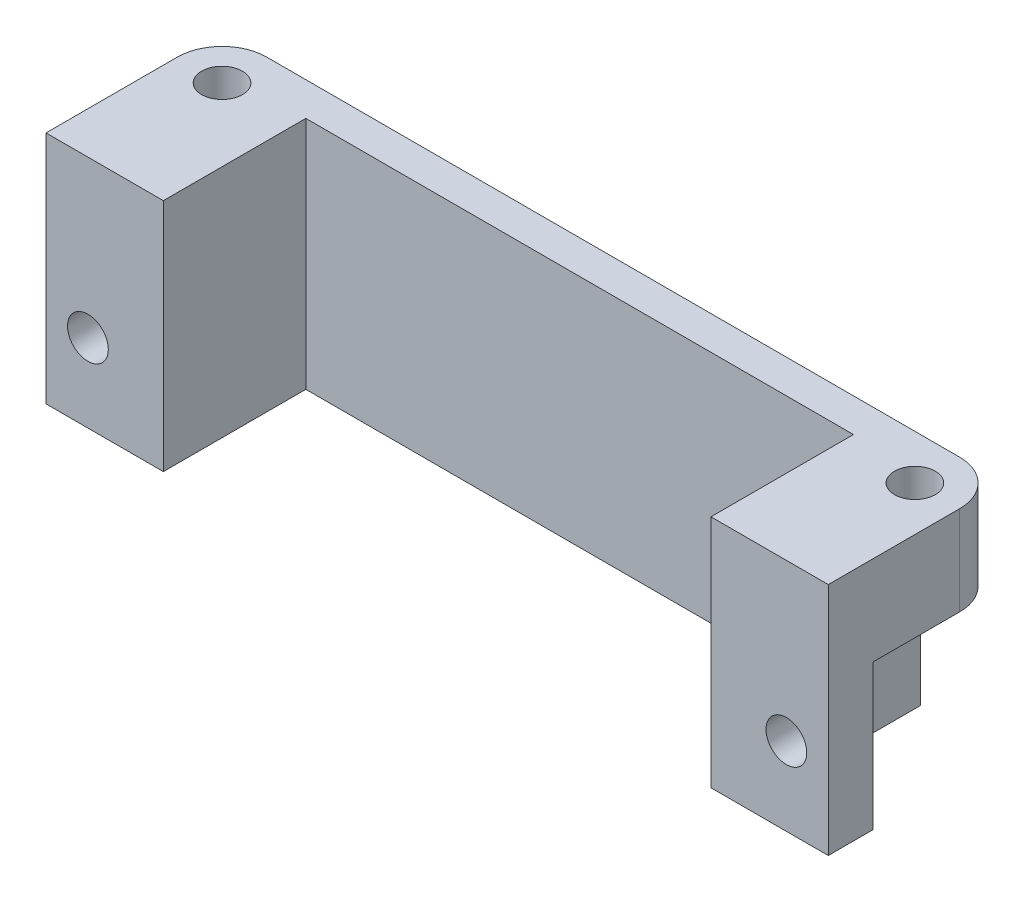
ISO-10303-21;
HEADER;
FILE_DESCRIPTION(('STEP AP214'),'2;1');
FILE_NAME('part.step','',(''),(''),'','','');
FILE_SCHEMA(('AUTOMOTIVE_DESIGN { 1 0 10303 214 1 1 1 1 }'));
ENDSEC;
DATA;
#1=APPLICATION_CONTEXT('core data for automotive mechanical design processes');
#2=APPLICATION_PROTOCOL_DEFINITION('international standard','automotive_design',2000,#1);
#3=PRODUCT_CONTEXT('',#1,'mechanical');
#4=PRODUCT('Part','Part','',(#3));
#5=PRODUCT_RELATED_PRODUCT_CATEGORY('part','',(#4));
#6=PRODUCT_DEFINITION_FORMATION('','',#4);
#7=PRODUCT_DEFINITION_CONTEXT('part definition',#1,'design');
#8=PRODUCT_DEFINITION('design','',#6,#7);
#9=PRODUCT_DEFINITION_SHAPE('','',#8);
#10=(LENGTH_UNIT() NAMED_UNIT(*) SI_UNIT(.MILLI.,.METRE.));
#11=(NAMED_UNIT(*) PLANE_ANGLE_UNIT() SI_UNIT($,.RADIAN.));
#12=(NAMED_UNIT(*) SI_UNIT($,.STERADIAN.) SOLID_ANGLE_UNIT());
#13=UNCERTAINTY_MEASURE_WITH_UNIT(LENGTH_MEASURE(1.E-05),#10,'distance_accuracy_value','');
#14=(GEOMETRIC_REPRESENTATION_CONTEXT(3) GLOBAL_UNCERTAINTY_ASSIGNED_CONTEXT((#13)) GLOBAL_UNIT_ASSIGNED_CONTEXT((#10,
#11,#12)) REPRESENTATION_CONTEXT('',''));
#15=CARTESIAN_POINT('',(0.,0.,0.));
#16=DIRECTION('',(0.,0.,1.));
#17=DIRECTION('',(1.,0.,0.));
#18=AXIS2_PLACEMENT_3D('',#15,#16,#17);
#19=CARTESIAN_POINT('',(0.,21.,-15.75));
#20=DIRECTION('',(0.,0.,1.));
#21=DIRECTION('',(1.,0.,0.));
#22=AXIS2_PLACEMENT_3D('',#19,#20,#21);
#23=PLANE('',#22);
#24=DIRECTION('',(-1.,0.,0.));
#25=VECTOR('',#24,1.);
#26=CARTESIAN_POINT('',(0.,21.,-15.75));
#27=LINE('',#26,#25);
#28=CARTESIAN_POINT('',(31.,21.,-15.75));
#29=VERTEX_POINT('',#28);
#30=CARTESIAN_POINT('',(-31.,21.,-15.75));
#31=VERTEX_POINT('',#30);
#32=EDGE_CURVE('E250',#29,#31,#27,.T.);
#33=ORIENTED_EDGE('',*,*,#32,.F.);
#34=DIRECTION('',(0.,-1.,0.));
#35=VECTOR('',#34,1.);
#36=CARTESIAN_POINT('',(31.,21.,-15.75));
#37=LINE('',#36,#35);
#38=CARTESIAN_POINT('',(31.,13.,-15.7500000000001));
#39=VERTEX_POINT('',#38);
#40=EDGE_CURVE('E280',#29,#39,#37,.T.);
#41=ORIENTED_EDGE('',*,*,#40,.T.);
#42=DIRECTION('',(-1.,0.,0.));
#43=VECTOR('',#42,1.);
#44=CARTESIAN_POINT('',(35.,13.,-15.7500000000001));
#45=LINE('',#44,#43);
#46=CARTESIAN_POINT('',(27.5,13.,-15.7500000000001));
#47=VERTEX_POINT('',#46);
#48=EDGE_CURVE('E168',#39,#47,#45,.T.);
#49=ORIENTED_EDGE('',*,*,#48,.T.);
#50=DIRECTION('',(0.,-1.,0.));
#51=VECTOR('',#50,1.);
#52=CARTESIAN_POINT('',(27.5,13.,-15.7500000000001));
#53=LINE('',#52,#51);
#54=CARTESIAN_POINT('',(27.5,0.,-15.7500000000001));
#55=VERTEX_POINT('',#54);
#56=EDGE_CURVE('E170',#47,#55,#53,.T.);
#57=ORIENTED_EDGE('',*,*,#56,.T.);
#58=DIRECTION('',(-1.,0.,0.));
#59=VECTOR('',#58,1.);
#60=CARTESIAN_POINT('',(0.,0.,-15.75));
#61=LINE('',#60,#59);
#62=CARTESIAN_POINT('',(-27.5,0.,-15.75));
#63=VERTEX_POINT('',#62);
#64=EDGE_CURVE('E242',#55,#63,#61,.T.);
#65=ORIENTED_EDGE('',*,*,#64,.T.);
#66=DIRECTION('',(0.,-1.,0.));
#67=VECTOR('',#66,1.);
#68=CARTESIAN_POINT('',(-27.5,13.,-15.75));
#69=LINE('',#68,#67);
#70=CARTESIAN_POINT('',(-27.5,13.,-15.75));
#71=VERTEX_POINT('',#70);
#72=EDGE_CURVE('E220',#71,#63,#69,.T.);
#73=ORIENTED_EDGE('',*,*,#72,.F.);
#74=DIRECTION('',(1.,0.,0.));
#75=VECTOR('',#74,1.);
#76=CARTESIAN_POINT('',(-35.,13.,-15.75));
#77=LINE('',#76,#75);
#78=CARTESIAN_POINT('',(-31.,13.,-15.75));
#79=VERTEX_POINT('',#78);
#80=EDGE_CURVE('E211',#79,#71,#77,.T.);
#81=ORIENTED_EDGE('',*,*,#80,.F.);
#82=DIRECTION('',(0.,-1.,0.));
#83=VECTOR('',#82,1.);
#84=CARTESIAN_POINT('',(-31.,21.,-15.75));
#85=LINE('',#84,#83);
#86=EDGE_CURVE('E275',#79,#31,#85,.F.);
#87=ORIENTED_EDGE('',*,*,#86,.T.);
#88=EDGE_LOOP('',(#33,#41,#49,#57,#65,#73,#81,#87));
#89=FACE_BOUND('',#88,.T.);
#90=ADVANCED_FACE('F36',(#89),#23,.F.);
#91=CARTESIAN_POINT('',(0.,0.,0.));
#92=DIRECTION('',(0.,1.,0.));
#93=DIRECTION('',(0.,0.,1.));
#94=AXIS2_PLACEMENT_3D('',#91,#92,#93);
#95=PLANE('',#94);
#96=DIRECTION('',(0.,0.,1.));
#97=VECTOR('',#96,1.);
#98=CARTESIAN_POINT('',(27.5,0.,-15.7500000000001));
#99=LINE('',#98,#97);
#100=CARTESIAN_POINT('',(27.5,0.,-4.00000000000006));
#101=VERTEX_POINT('',#100);
#102=EDGE_CURVE('E161',#55,#101,#99,.T.);
#103=ORIENTED_EDGE('',*,*,#102,.T.);
#104=DIRECTION('',(1.,0.,0.));
#105=VECTOR('',#104,1.);
#106=CARTESIAN_POINT('',(35.,0.,-4.00000000000008));
#107=LINE('',#106,#105);
#108=CARTESIAN_POINT('',(35.,0.,-4.00000000000008));
#109=VERTEX_POINT('',#108);
#110=EDGE_CURVE('E293',#101,#109,#107,.T.);
#111=ORIENTED_EDGE('',*,*,#110,.T.);
#112=DIRECTION('',(0.,0.,-1.));
#113=VECTOR('',#112,1.);
#114=CARTESIAN_POINT('',(35.,0.,0.));
#115=LINE('',#114,#113);
#116=CARTESIAN_POINT('',(35.,0.,0.));
#117=VERTEX_POINT('',#116);
#118=EDGE_CURVE('E167',#117,#109,#115,.T.);
#119=ORIENTED_EDGE('',*,*,#118,.F.);
#120=DIRECTION('',(1.,0.,0.));
#121=VECTOR('',#120,1.);
#122=CARTESIAN_POINT('',(0.,0.,0.));
#123=LINE('',#122,#121);
#124=CARTESIAN_POINT('',(24.5,0.,0.));
#125=VERTEX_POINT('',#124);
#126=EDGE_CURVE('E184',#125,#117,#123,.T.);
#127=ORIENTED_EDGE('',*,*,#126,.F.);
#128=DIRECTION('',(0.,0.,-1.));
#129=VECTOR('',#128,1.);
#130=CARTESIAN_POINT('',(24.5,0.,0.));
#131=LINE('',#130,#129);
#132=CARTESIAN_POINT('',(24.5,0.,-12.7500000000001));
#133=VERTEX_POINT('',#132);
#134=EDGE_CURVE('E191',#125,#133,#131,.T.);
#135=ORIENTED_EDGE('',*,*,#134,.T.);
#136=DIRECTION('',(-1.,0.,0.));
#137=VECTOR('',#136,1.);
#138=CARTESIAN_POINT('',(0.,0.,-12.75));
#139=LINE('',#138,#137);
#140=CARTESIAN_POINT('',(-24.5,0.,-12.75));
#141=VERTEX_POINT('',#140);
#142=EDGE_CURVE('E261',#133,#141,#139,.T.);
#143=ORIENTED_EDGE('',*,*,#142,.T.);
#144=DIRECTION('',(0.,0.,-1.));
#145=VECTOR('',#144,1.);
#146=CARTESIAN_POINT('',(-24.5,0.,0.));
#147=LINE('',#146,#145);
#148=CARTESIAN_POINT('',(-24.5,0.,0.));
#149=VERTEX_POINT('',#148);
#150=EDGE_CURVE('E258',#149,#141,#147,.T.);
#151=ORIENTED_EDGE('',*,*,#150,.F.);
#152=DIRECTION('',(-1.,0.,0.));
#153=VECTOR('',#152,1.);
#154=CARTESIAN_POINT('',(0.,0.,0.));
#155=LINE('',#154,#153);
#156=CARTESIAN_POINT('',(-35.,0.,0.));
#157=VERTEX_POINT('',#156);
#158=EDGE_CURVE('E255',#149,#157,#155,.T.);
#159=ORIENTED_EDGE('',*,*,#158,.T.);
#160=DIRECTION('',(0.,0.,-1.));
#161=VECTOR('',#160,1.);
#162=CARTESIAN_POINT('',(-35.,0.,0.));
#163=LINE('',#162,#161);
#164=CARTESIAN_POINT('',(-35.,0.,-4.));
#165=VERTEX_POINT('',#164);
#166=EDGE_CURVE('E237',#157,#165,#163,.T.);
#167=ORIENTED_EDGE('',*,*,#166,.T.);
#168=DIRECTION('',(-1.,0.,0.));
#169=VECTOR('',#168,1.);
#170=CARTESIAN_POINT('',(-35.,0.,-4.));
#171=LINE('',#170,#169);
#172=CARTESIAN_POINT('',(-27.5,0.,-4.));
#173=VERTEX_POINT('',#172);
#174=EDGE_CURVE('E212',#173,#165,#171,.T.);
#175=ORIENTED_EDGE('',*,*,#174,.F.);
#176=DIRECTION('',(0.,0.,1.));
#177=VECTOR('',#176,1.);
#178=CARTESIAN_POINT('',(-27.5,0.,-15.75));
#179=LINE('',#178,#177);
#180=EDGE_CURVE('E205',#63,#173,#179,.T.);
#181=ORIENTED_EDGE('',*,*,#180,.F.);
#182=ORIENTED_EDGE('',*,*,#64,.F.);
#183=EDGE_LOOP('',(#103,#111,#119,#127,#135,#143,#151,#159,#167,#175,#181,#182));
#184=FACE_BOUND('',#183,.T.);
#185=ADVANCED_FACE('F301',(#184),#95,.F.);
#186=CARTESIAN_POINT('',(35.,21.,0.));
#187=DIRECTION('',(-1.,0.,0.));
#188=DIRECTION('',(0.,0.,1.));
#189=AXIS2_PLACEMENT_3D('',#186,#187,#188);
#190=PLANE('',#189);
#191=DIRECTION('',(0.,0.,-1.));
#192=VECTOR('',#191,1.);
#193=CARTESIAN_POINT('',(35.,13.,-15.7500000000001));
#194=LINE('',#193,#192);
#195=CARTESIAN_POINT('',(35.,13.,-4.00000000000008));
#196=VERTEX_POINT('',#195);
#197=CARTESIAN_POINT('',(35.,13.,-11.75));
#198=VERTEX_POINT('',#197);
#199=EDGE_CURVE('E158',#196,#198,#194,.T.);
#200=ORIENTED_EDGE('',*,*,#199,.T.);
#201=DIRECTION('',(0.,-1.,0.));
#202=VECTOR('',#201,1.);
#203=CARTESIAN_POINT('',(35.,21.,-11.75));
#204=LINE('',#203,#202);
#205=CARTESIAN_POINT('',(35.,21.,-11.75));
#206=VERTEX_POINT('',#205);
#207=EDGE_CURVE('E44',#198,#206,#204,.F.);
#208=ORIENTED_EDGE('',*,*,#207,.T.);
#209=DIRECTION('',(0.,0.,-1.));
#210=VECTOR('',#209,1.);
#211=CARTESIAN_POINT('',(35.,21.,0.));
#212=LINE('',#211,#210);
#213=CARTESIAN_POINT('',(35.,21.,0.));
#214=VERTEX_POINT('',#213);
#215=EDGE_CURVE('E181',#214,#206,#212,.T.);
#216=ORIENTED_EDGE('',*,*,#215,.F.);
#217=DIRECTION('',(0.,-1.,0.));
#218=VECTOR('',#217,1.);
#219=CARTESIAN_POINT('',(35.,21.,0.));
#220=LINE('',#219,#218);
#221=EDGE_CURVE('E189',#214,#117,#220,.T.);
#222=ORIENTED_EDGE('',*,*,#221,.T.);
#223=ORIENTED_EDGE('',*,*,#118,.T.);
#224=DIRECTION('',(0.,-1.,0.));
#225=VECTOR('',#224,1.);
#226=CARTESIAN_POINT('',(35.,13.,-4.00000000000008));
#227=LINE('',#226,#225);
#228=EDGE_CURVE('E153',#196,#109,#227,.T.);
#229=ORIENTED_EDGE('',*,*,#228,.F.);
#230=EDGE_LOOP('',(#200,#208,#216,#222,#223,#229));
#231=FACE_BOUND('',#230,.T.);
#232=ADVANCED_FACE('F164',(#231),#190,.F.);
#233=CARTESIAN_POINT('',(-35.,21.,0.));
#234=DIRECTION('',(-1.,0.,0.));
#235=DIRECTION('',(0.,0.,1.));
#236=AXIS2_PLACEMENT_3D('',#233,#234,#235);
#237=PLANE('',#236);
#238=DIRECTION('',(0.,0.,-1.));
#239=VECTOR('',#238,1.);
#240=CARTESIAN_POINT('',(-35.,21.,0.));
#241=LINE('',#240,#239);
#242=CARTESIAN_POINT('',(-35.,21.,0.));
#243=VERTEX_POINT('',#242);
#244=CARTESIAN_POINT('',(-35.,21.,-11.75));
#245=VERTEX_POINT('',#244);
#246=EDGE_CURVE('E238',#243,#245,#241,.T.);
#247=ORIENTED_EDGE('',*,*,#246,.T.);
#248=DIRECTION('',(0.,-1.,0.));
#249=VECTOR('',#248,1.);
#250=CARTESIAN_POINT('',(-35.,13.,-11.75));
#251=LINE('',#250,#249);
#252=CARTESIAN_POINT('',(-35.,13.,-11.75));
#253=VERTEX_POINT('',#252);
#254=EDGE_CURVE('E270',#245,#253,#251,.T.);
#255=ORIENTED_EDGE('',*,*,#254,.T.);
#256=DIRECTION('',(0.,0.,-1.));
#257=VECTOR('',#256,1.);
#258=CARTESIAN_POINT('',(-35.,13.,-15.75));
#259=LINE('',#258,#257);
#260=CARTESIAN_POINT('',(-35.,13.,-4.));
#261=VERTEX_POINT('',#260);
#262=EDGE_CURVE('E208',#261,#253,#259,.T.);
#263=ORIENTED_EDGE('',*,*,#262,.F.);
#264=DIRECTION('',(0.,-1.,0.));
#265=VECTOR('',#264,1.);
#266=CARTESIAN_POINT('',(-35.,13.,-4.));
#267=LINE('',#266,#265);
#268=EDGE_CURVE('E224',#261,#165,#267,.T.);
#269=ORIENTED_EDGE('',*,*,#268,.T.);
#270=ORIENTED_EDGE('',*,*,#166,.F.);
#271=DIRECTION('',(0.,-1.,0.));
#272=VECTOR('',#271,1.);
#273=CARTESIAN_POINT('',(-35.,21.,0.));
#274=LINE('',#273,#272);
#275=EDGE_CURVE('E268',#243,#157,#274,.T.);
#276=ORIENTED_EDGE('',*,*,#275,.F.);
#277=EDGE_LOOP('',(#247,#255,#263,#269,#270,#276));
#278=FACE_BOUND('',#277,.T.);
#279=ADVANCED_FACE('F318',(#278),#237,.T.);
#280=CARTESIAN_POINT('',(0.,21.,0.));
#281=DIRECTION('',(0.,0.,1.));
#282=DIRECTION('',(1.,0.,0.));
#283=AXIS2_PLACEMENT_3D('',#280,#281,#282);
#284=PLANE('',#283);
#285=CARTESIAN_POINT('',(-31.25,7.,0.));
#286=DIRECTION('',(0.,0.,1.));
#287=DIRECTION('',(1.,0.,0.));
#288=AXIS2_PLACEMENT_3D('',#285,#286,#287);
#289=CIRCLE('',#288,1.825);
#290=CARTESIAN_POINT('',(-29.425,7.,0.));
#291=VERTEX_POINT('',#290);
#292=EDGE_CURVE('E234',#291,#291,#289,.T.);
#293=ORIENTED_EDGE('',*,*,#292,.F.);
#294=EDGE_LOOP('',(#293));
#295=FACE_BOUND('',#294,.T.);
#296=ORIENTED_EDGE('',*,*,#158,.F.);
#297=DIRECTION('',(0.,-1.,0.));
#298=VECTOR('',#297,1.);
#299=CARTESIAN_POINT('',(-24.5,21.,0.));
#300=LINE('',#299,#298);
#301=CARTESIAN_POINT('',(-24.5,21.,0.));
#302=VERTEX_POINT('',#301);
#303=EDGE_CURVE('E266',#302,#149,#300,.T.);
#304=ORIENTED_EDGE('',*,*,#303,.F.);
#305=DIRECTION('',(-1.,0.,0.));
#306=VECTOR('',#305,1.);
#307=CARTESIAN_POINT('',(0.,21.,0.));
#308=LINE('',#307,#306);
#309=EDGE_CURVE('E241',#302,#243,#308,.T.);
#310=ORIENTED_EDGE('',*,*,#309,.T.);
#311=ORIENTED_EDGE('',*,*,#275,.T.);
#312=EDGE_LOOP('',(#296,#304,#310,#311));
#313=FACE_BOUND('',#312,.T.);
#314=ADVANCED_FACE('F323',(#295,#313),#284,.T.);
#315=CARTESIAN_POINT('',(-24.5,21.,0.));
#316=DIRECTION('',(-1.,0.,0.));
#317=DIRECTION('',(0.,0.,1.));
#318=AXIS2_PLACEMENT_3D('',#315,#316,#317);
#319=PLANE('',#318);
#320=ORIENTED_EDGE('',*,*,#150,.T.);
#321=DIRECTION('',(0.,-1.,0.));
#322=VECTOR('',#321,1.);
#323=CARTESIAN_POINT('',(-24.5,21.,-12.75));
#324=LINE('',#323,#322);
#325=CARTESIAN_POINT('',(-24.5,21.,-12.75));
#326=VERTEX_POINT('',#325);
#327=EDGE_CURVE('E252',#326,#141,#324,.T.);
#328=ORIENTED_EDGE('',*,*,#327,.F.);
#329=DIRECTION('',(0.,0.,-1.));
#330=VECTOR('',#329,1.);
#331=CARTESIAN_POINT('',(-24.5,21.,0.));
#332=LINE('',#331,#330);
#333=EDGE_CURVE('E245',#302,#326,#332,.T.);
#334=ORIENTED_EDGE('',*,*,#333,.F.);
#335=ORIENTED_EDGE('',*,*,#303,.T.);
#336=EDGE_LOOP('',(#320,#328,#334,#335));
#337=FACE_BOUND('',#336,.T.);
#338=ADVANCED_FACE('F329',(#337),#319,.F.);
#339=CARTESIAN_POINT('',(0.,21.,-12.75));
#340=DIRECTION('',(0.,0.,1.));
#341=DIRECTION('',(1.,0.,0.));
#342=AXIS2_PLACEMENT_3D('',#339,#340,#341);
#343=PLANE('',#342);
#344=ORIENTED_EDGE('',*,*,#142,.F.);
#345=DIRECTION('',(0.,-1.,0.));
#346=VECTOR('',#345,1.);
#347=CARTESIAN_POINT('',(24.5,21.,-12.7500000000001));
#348=LINE('',#347,#346);
#349=CARTESIAN_POINT('',(24.5,21.,-12.7500000000001));
#350=VERTEX_POINT('',#349);
#351=EDGE_CURVE('E198',#350,#133,#348,.T.);
#352=ORIENTED_EDGE('',*,*,#351,.F.);
#353=DIRECTION('',(-1.,0.,0.));
#354=VECTOR('',#353,1.);
#355=CARTESIAN_POINT('',(0.,21.,-12.75));
#356=LINE('',#355,#354);
#357=EDGE_CURVE('E247',#350,#326,#356,.T.);
#358=ORIENTED_EDGE('',*,*,#357,.T.);
#359=ORIENTED_EDGE('',*,*,#327,.T.);
#360=EDGE_LOOP('',(#344,#352,#358,#359));
#361=FACE_BOUND('',#360,.T.);
#362=ADVANCED_FACE('F332',(#361),#343,.T.);
#363=CARTESIAN_POINT('',(0.,21.,0.));
#364=DIRECTION('',(0.,1.,0.));
#365=DIRECTION('',(0.,0.,1.));
#366=AXIS2_PLACEMENT_3D('',#363,#364,#365);
#367=PLANE('',#366);
#368=CARTESIAN_POINT('',(31.,21.,-11.7500000000001));
#369=DIRECTION('',(0.,1.,0.));
#370=DIRECTION('',(0.,0.,-1.));
#371=AXIS2_PLACEMENT_3D('',#368,#369,#370);
#372=CIRCLE('',#371,1.825);
#373=CARTESIAN_POINT('',(31.,21.,-13.5750000000001));
#374=VERTEX_POINT('',#373);
#375=EDGE_CURVE('E295',#374,#374,#372,.T.);
#376=ORIENTED_EDGE('',*,*,#375,.F.);
#377=EDGE_LOOP('',(#376));
#378=FACE_BOUND('',#377,.T.);
#379=CARTESIAN_POINT('',(-31.,21.,-11.75));
#380=DIRECTION('',(0.,-1.,0.));
#381=DIRECTION('',(0.,0.,-1.));
#382=AXIS2_PLACEMENT_3D('',#379,#380,#381);
#383=CIRCLE('',#382,1.825);
#384=CARTESIAN_POINT('',(-31.,21.,-13.575));
#385=VERTEX_POINT('',#384);
#386=EDGE_CURVE('E202',#385,#385,#383,.T.);
#387=ORIENTED_EDGE('',*,*,#386,.T.);
#388=EDGE_LOOP('',(#387));
#389=FACE_BOUND('',#388,.T.);
#390=ORIENTED_EDGE('',*,*,#215,.T.);
#391=CARTESIAN_POINT('',(31.,21.,-11.75));
#392=DIRECTION('',(0.,1.,0.));
#393=DIRECTION('',(0.,0.,1.));
#394=AXIS2_PLACEMENT_3D('',#391,#392,#393);
#395=CIRCLE('',#394,4.);
#396=EDGE_CURVE('E11',#206,#29,#395,.T.);
#397=ORIENTED_EDGE('',*,*,#396,.T.);
#398=ORIENTED_EDGE('',*,*,#32,.T.);
#399=CARTESIAN_POINT('',(-31.,21.,-11.75));
#400=DIRECTION('',(0.,1.,0.));
#401=DIRECTION('',(0.,0.,1.));
#402=AXIS2_PLACEMENT_3D('',#399,#400,#401);
#403=CIRCLE('',#402,4.);
#404=EDGE_CURVE('E278',#31,#245,#403,.T.);
#405=ORIENTED_EDGE('',*,*,#404,.T.);
#406=ORIENTED_EDGE('',*,*,#246,.F.);
#407=ORIENTED_EDGE('',*,*,#309,.F.);
#408=ORIENTED_EDGE('',*,*,#333,.T.);
#409=ORIENTED_EDGE('',*,*,#357,.F.);
#410=DIRECTION('',(0.,0.,-1.));
#411=VECTOR('',#410,1.);
#412=CARTESIAN_POINT('',(24.5,21.,0.));
#413=LINE('',#412,#411);
#414=CARTESIAN_POINT('',(24.5,21.,0.));
#415=VERTEX_POINT('',#414);
#416=EDGE_CURVE('E183',#415,#350,#413,.T.);
#417=ORIENTED_EDGE('',*,*,#416,.F.);
#418=DIRECTION('',(1.,0.,0.));
#419=VECTOR('',#418,1.);
#420=CARTESIAN_POINT('',(0.,21.,0.));
#421=LINE('',#420,#419);
#422=EDGE_CURVE('E187',#415,#214,#421,.T.);
#423=ORIENTED_EDGE('',*,*,#422,.T.);
#424=EDGE_LOOP('',(#390,#397,#398,#405,#406,#407,#408,#409,#417,#423));
#425=FACE_BOUND('',#424,.T.);
#426=ADVANCED_FACE('F315',(#378,#389,#425),#367,.T.);
#427=CARTESIAN_POINT('',(-31.25,7.,-4.));
#428=DIRECTION('',(0.,0.,1.));
#429=DIRECTION('',(1.,0.,0.));
#430=AXIS2_PLACEMENT_3D('',#427,#428,#429);
#431=CYLINDRICAL_SURFACE('',#430,1.825);
#432=CARTESIAN_POINT('',(-31.25,7.,-4.));
#433=DIRECTION('',(0.,0.,1.));
#434=DIRECTION('',(1.,0.,0.));
#435=AXIS2_PLACEMENT_3D('',#432,#433,#434);
#436=CIRCLE('',#435,1.825);
#437=CARTESIAN_POINT('',(-29.425,7.,-4.));
#438=VERTEX_POINT('',#437);
#439=EDGE_CURVE('E227',#438,#438,#436,.T.);
#440=ORIENTED_EDGE('',*,*,#439,.F.);
#441=EDGE_LOOP('',(#440));
#442=FACE_BOUND('',#441,.T.);
#443=ORIENTED_EDGE('',*,*,#292,.T.);
#444=EDGE_LOOP('',(#443));
#445=FACE_BOUND('',#444,.T.);
#446=ADVANCED_FACE('F389',(#442,#445),#431,.F.);
#447=CARTESIAN_POINT('',(-35.,13.,-4.));
#448=DIRECTION('',(0.,0.,1.));
#449=DIRECTION('',(1.,0.,0.));
#450=AXIS2_PLACEMENT_3D('',#447,#448,#449);
#451=PLANE('',#450);
#452=ORIENTED_EDGE('',*,*,#439,.T.);
#453=EDGE_LOOP('',(#452));
#454=FACE_BOUND('',#453,.T.);
#455=ORIENTED_EDGE('',*,*,#174,.T.);
#456=ORIENTED_EDGE('',*,*,#268,.F.);
#457=DIRECTION('',(-1.,0.,0.));
#458=VECTOR('',#457,1.);
#459=CARTESIAN_POINT('',(-35.,13.,-4.));
#460=LINE('',#459,#458);
#461=CARTESIAN_POINT('',(-27.5,13.,-4.));
#462=VERTEX_POINT('',#461);
#463=EDGE_CURVE('E217',#462,#261,#460,.T.);
#464=ORIENTED_EDGE('',*,*,#463,.F.);
#465=DIRECTION('',(0.,-1.,0.));
#466=VECTOR('',#465,1.);
#467=CARTESIAN_POINT('',(-27.5,13.,-4.));
#468=LINE('',#467,#466);
#469=EDGE_CURVE('E228',#462,#173,#468,.T.);
#470=ORIENTED_EDGE('',*,*,#469,.T.);
#471=EDGE_LOOP('',(#455,#456,#464,#470));
#472=FACE_BOUND('',#471,.T.);
#473=ADVANCED_FACE('F383',(#454,#472),#451,.F.);
#474=CARTESIAN_POINT('',(-27.5,13.,-15.75));
#475=DIRECTION('',(1.,0.,0.));
#476=DIRECTION('',(0.,0.,-1.));
#477=AXIS2_PLACEMENT_3D('',#474,#475,#476);
#478=PLANE('',#477);
#479=ORIENTED_EDGE('',*,*,#180,.T.);
#480=ORIENTED_EDGE('',*,*,#469,.F.);
#481=DIRECTION('',(0.,0.,1.));
#482=VECTOR('',#481,1.);
#483=CARTESIAN_POINT('',(-27.5,13.,-15.75));
#484=LINE('',#483,#482);
#485=EDGE_CURVE('E214',#71,#462,#484,.T.);
#486=ORIENTED_EDGE('',*,*,#485,.F.);
#487=ORIENTED_EDGE('',*,*,#72,.T.);
#488=EDGE_LOOP('',(#479,#480,#486,#487));
#489=FACE_BOUND('',#488,.T.);
#490=ADVANCED_FACE('F304',(#489),#478,.F.);
#491=CARTESIAN_POINT('',(0.,13.,0.));
#492=DIRECTION('',(0.,1.,0.));
#493=DIRECTION('',(0.,0.,1.));
#494=AXIS2_PLACEMENT_3D('',#491,#492,#493);
#495=PLANE('',#494);
#496=CARTESIAN_POINT('',(-31.,13.,-11.75));
#497=DIRECTION('',(0.,-1.,0.));
#498=DIRECTION('',(0.,0.,-1.));
#499=AXIS2_PLACEMENT_3D('',#496,#497,#498);
#500=CIRCLE('',#499,1.825);
#501=CARTESIAN_POINT('',(-31.,13.,-13.575));
#502=VERTEX_POINT('',#501);
#503=EDGE_CURVE('E201',#502,#502,#500,.T.);
#504=ORIENTED_EDGE('',*,*,#503,.F.);
#505=EDGE_LOOP('',(#504));
#506=FACE_BOUND('',#505,.T.);
#507=ORIENTED_EDGE('',*,*,#262,.T.);
#508=CARTESIAN_POINT('',(-31.,13.,-11.75));
#509=DIRECTION('',(0.,1.,0.));
#510=DIRECTION('',(0.,0.,1.));
#511=AXIS2_PLACEMENT_3D('',#508,#509,#510);
#512=CIRCLE('',#511,4.);
#513=EDGE_CURVE('E273',#253,#79,#512,.F.);
#514=ORIENTED_EDGE('',*,*,#513,.T.);
#515=ORIENTED_EDGE('',*,*,#80,.T.);
#516=ORIENTED_EDGE('',*,*,#485,.T.);
#517=ORIENTED_EDGE('',*,*,#463,.T.);
#518=EDGE_LOOP('',(#507,#514,#515,#516,#517));
#519=FACE_BOUND('',#518,.T.);
#520=ADVANCED_FACE('F371',(#506,#519),#495,.F.);
#521=CARTESIAN_POINT('',(-31.,21.,-11.75));
#522=DIRECTION('',(0.,1.,0.));
#523=DIRECTION('',(0.,0.,1.));
#524=AXIS2_PLACEMENT_3D('',#521,#522,#523);
#525=CYLINDRICAL_SURFACE('',#524,4.);
#526=ORIENTED_EDGE('',*,*,#404,.F.);
#527=ORIENTED_EDGE('',*,*,#86,.F.);
#528=ORIENTED_EDGE('',*,*,#513,.F.);
#529=ORIENTED_EDGE('',*,*,#254,.F.);
#530=EDGE_LOOP('',(#526,#527,#528,#529));
#531=FACE_BOUND('',#530,.T.);
#532=ADVANCED_FACE('F311',(#531),#525,.T.);
#533=CARTESIAN_POINT('',(-31.,21.,-11.75));
#534=DIRECTION('',(0.,-1.,0.));
#535=DIRECTION('',(0.,0.,-1.));
#536=AXIS2_PLACEMENT_3D('',#533,#534,#535);
#537=CYLINDRICAL_SURFACE('',#536,1.825);
#538=ORIENTED_EDGE('',*,*,#386,.F.);
#539=EDGE_LOOP('',(#538));
#540=FACE_BOUND('',#539,.T.);
#541=ORIENTED_EDGE('',*,*,#503,.T.);
#542=EDGE_LOOP('',(#541));
#543=FACE_BOUND('',#542,.T.);
#544=ADVANCED_FACE('F352',(#540,#543),#537,.F.);
#545=CARTESIAN_POINT('',(24.5,21.,0.));
#546=DIRECTION('',(-1.,0.,0.));
#547=DIRECTION('',(0.,0.,1.));
#548=AXIS2_PLACEMENT_3D('',#545,#546,#547);
#549=PLANE('',#548);
#550=ORIENTED_EDGE('',*,*,#134,.F.);
#551=DIRECTION('',(0.,-1.,0.));
#552=VECTOR('',#551,1.);
#553=CARTESIAN_POINT('',(24.5,21.,0.));
#554=LINE('',#553,#552);
#555=EDGE_CURVE('E196',#415,#125,#554,.T.);
#556=ORIENTED_EDGE('',*,*,#555,.F.);
#557=ORIENTED_EDGE('',*,*,#416,.T.);
#558=ORIENTED_EDGE('',*,*,#351,.T.);
#559=EDGE_LOOP('',(#550,#556,#557,#558));
#560=FACE_BOUND('',#559,.T.);
#561=ADVANCED_FACE('F335',(#560),#549,.T.);
#562=CARTESIAN_POINT('',(0.,21.,0.));
#563=DIRECTION('',(0.,0.,-1.));
#564=DIRECTION('',(-1.,0.,0.));
#565=AXIS2_PLACEMENT_3D('',#562,#563,#564);
#566=PLANE('',#565);
#567=CARTESIAN_POINT('',(31.25,7.,0.));
#568=DIRECTION('',(0.,0.,-1.));
#569=DIRECTION('',(-1.,0.,0.));
#570=AXIS2_PLACEMENT_3D('',#567,#568,#569);
#571=CIRCLE('',#570,1.825);
#572=CARTESIAN_POINT('',(29.425,7.,0.));
#573=VERTEX_POINT('',#572);
#574=EDGE_CURVE('E178',#573,#573,#571,.T.);
#575=ORIENTED_EDGE('',*,*,#574,.T.);
#576=EDGE_LOOP('',(#575));
#577=FACE_BOUND('',#576,.T.);
#578=ORIENTED_EDGE('',*,*,#126,.T.);
#579=ORIENTED_EDGE('',*,*,#221,.F.);
#580=ORIENTED_EDGE('',*,*,#422,.F.);
#581=ORIENTED_EDGE('',*,*,#555,.T.);
#582=EDGE_LOOP('',(#578,#579,#580,#581));
#583=FACE_BOUND('',#582,.T.);
#584=ADVANCED_FACE('F339',(#577,#583),#566,.F.);
#585=CARTESIAN_POINT('',(31.25,7.,-4.00000000000007));
#586=DIRECTION('',(0.,0.,1.));
#587=DIRECTION('',(1.,0.,0.));
#588=AXIS2_PLACEMENT_3D('',#585,#586,#587);
#589=CYLINDRICAL_SURFACE('',#588,1.825);
#590=CARTESIAN_POINT('',(31.25,7.,-4.00000000000007));
#591=DIRECTION('',(0.,0.,-1.));
#592=DIRECTION('',(-1.,0.,0.));
#593=AXIS2_PLACEMENT_3D('',#590,#591,#592);
#594=CIRCLE('',#593,1.825);
#595=CARTESIAN_POINT('',(29.425,7.,-4.00000000000007));
#596=VERTEX_POINT('',#595);
#597=EDGE_CURVE('E175',#596,#596,#594,.T.);
#598=ORIENTED_EDGE('',*,*,#597,.T.);
#599=EDGE_LOOP('',(#598));
#600=FACE_BOUND('',#599,.T.);
#601=ORIENTED_EDGE('',*,*,#574,.F.);
#602=EDGE_LOOP('',(#601));
#603=FACE_BOUND('',#602,.T.);
#604=ADVANCED_FACE('F342',(#600,#603),#589,.F.);
#605=CARTESIAN_POINT('',(27.5,13.,-15.7500000000001));
#606=DIRECTION('',(1.,0.,0.));
#607=DIRECTION('',(0.,0.,-1.));
#608=AXIS2_PLACEMENT_3D('',#605,#606,#607);
#609=PLANE('',#608);
#610=ORIENTED_EDGE('',*,*,#102,.F.);
#611=ORIENTED_EDGE('',*,*,#56,.F.);
#612=DIRECTION('',(0.,0.,1.));
#613=VECTOR('',#612,1.);
#614=CARTESIAN_POINT('',(27.5,13.,-15.7500000000001));
#615=LINE('',#614,#613);
#616=CARTESIAN_POINT('',(27.5,13.,-4.00000000000006));
#617=VERTEX_POINT('',#616);
#618=EDGE_CURVE('E157',#47,#617,#615,.T.);
#619=ORIENTED_EDGE('',*,*,#618,.T.);
#620=DIRECTION('',(0.,-1.,0.));
#621=VECTOR('',#620,1.);
#622=CARTESIAN_POINT('',(27.5,13.,-4.00000000000006));
#623=LINE('',#622,#621);
#624=EDGE_CURVE('E155',#617,#101,#623,.T.);
#625=ORIENTED_EDGE('',*,*,#624,.T.);
#626=EDGE_LOOP('',(#610,#611,#619,#625));
#627=FACE_BOUND('',#626,.T.);
#628=ADVANCED_FACE('F349',(#627),#609,.T.);
#629=CARTESIAN_POINT('',(35.,13.,-4.00000000000008));
#630=DIRECTION('',(0.,0.,-1.));
#631=DIRECTION('',(-1.,0.,0.));
#632=AXIS2_PLACEMENT_3D('',#629,#630,#631);
#633=PLANE('',#632);
#634=ORIENTED_EDGE('',*,*,#597,.F.);
#635=EDGE_LOOP('',(#634));
#636=FACE_BOUND('',#635,.T.);
#637=ORIENTED_EDGE('',*,*,#110,.F.);
#638=ORIENTED_EDGE('',*,*,#624,.F.);
#639=DIRECTION('',(1.,0.,0.));
#640=VECTOR('',#639,1.);
#641=CARTESIAN_POINT('',(35.,13.,-4.00000000000008));
#642=LINE('',#641,#640);
#643=EDGE_CURVE('E149',#617,#196,#642,.T.);
#644=ORIENTED_EDGE('',*,*,#643,.T.);
#645=ORIENTED_EDGE('',*,*,#228,.T.);
#646=EDGE_LOOP('',(#637,#638,#644,#645));
#647=FACE_BOUND('',#646,.T.);
#648=ADVANCED_FACE('F151',(#636,#647),#633,.T.);
#649=CARTESIAN_POINT('',(0.,13.,0.));
#650=DIRECTION('',(0.,1.,0.));
#651=DIRECTION('',(0.,0.,1.));
#652=AXIS2_PLACEMENT_3D('',#649,#650,#651);
#653=PLANE('',#652);
#654=CARTESIAN_POINT('',(31.,13.,-11.7500000000001));
#655=DIRECTION('',(0.,1.,0.));
#656=DIRECTION('',(0.,0.,-1.));
#657=AXIS2_PLACEMENT_3D('',#654,#655,#656);
#658=CIRCLE('',#657,1.825);
#659=CARTESIAN_POINT('',(31.,13.,-13.5750000000001));
#660=VERTEX_POINT('',#659);
#661=EDGE_CURVE('E404',#660,#660,#658,.T.);
#662=ORIENTED_EDGE('',*,*,#661,.T.);
#663=EDGE_LOOP('',(#662));
#664=FACE_BOUND('',#663,.T.);
#665=ORIENTED_EDGE('',*,*,#48,.F.);
#666=CARTESIAN_POINT('',(31.,13.,-11.75));
#667=DIRECTION('',(0.,1.,0.));
#668=DIRECTION('',(0.,0.,1.));
#669=AXIS2_PLACEMENT_3D('',#666,#667,#668);
#670=CIRCLE('',#669,4.);
#671=EDGE_CURVE('E58',#39,#198,#670,.F.);
#672=ORIENTED_EDGE('',*,*,#671,.T.);
#673=ORIENTED_EDGE('',*,*,#199,.F.);
#674=ORIENTED_EDGE('',*,*,#643,.F.);
#675=ORIENTED_EDGE('',*,*,#618,.F.);
#676=EDGE_LOOP('',(#665,#672,#673,#674,#675));
#677=FACE_BOUND('',#676,.T.);
#678=ADVANCED_FACE('F160',(#664,#677),#653,.F.);
#679=CARTESIAN_POINT('',(31.,21.,-11.75));
#680=DIRECTION('',(0.,-1.,0.));
#681=DIRECTION('',(0.,0.,-1.));
#682=AXIS2_PLACEMENT_3D('',#679,#680,#681);
#683=CYLINDRICAL_SURFACE('',#682,4.);
#684=ORIENTED_EDGE('',*,*,#396,.F.);
#685=ORIENTED_EDGE('',*,*,#207,.F.);
#686=ORIENTED_EDGE('',*,*,#671,.F.);
#687=ORIENTED_EDGE('',*,*,#40,.F.);
#688=EDGE_LOOP('',(#684,#685,#686,#687));
#689=FACE_BOUND('',#688,.T.);
#690=ADVANCED_FACE('F38',(#689),#683,.T.);
#691=CARTESIAN_POINT('',(31.,21.,-11.7500000000001));
#692=DIRECTION('',(0.,-1.,0.));
#693=DIRECTION('',(0.,0.,-1.));
#694=AXIS2_PLACEMENT_3D('',#691,#692,#693);
#695=CYLINDRICAL_SURFACE('',#694,1.825);
#696=ORIENTED_EDGE('',*,*,#375,.T.);
#697=EDGE_LOOP('',(#696));
#698=FACE_BOUND('',#697,.T.);
#699=ORIENTED_EDGE('',*,*,#661,.F.);
#700=EDGE_LOOP('',(#699));
#701=FACE_BOUND('',#700,.T.);
#702=ADVANCED_FACE('F411',(#698,#701),#695,.F.);
#703=CLOSED_SHELL('',(#90,#185,#232,#279,#314,#338,#362,#426,#446,#473,#490,#520,#532,#544,#561,
#584,#604,#628,#648,#678,#690,#702));
#704=MANIFOLD_SOLID_BREP('B2',#703);
#705=ADVANCED_BREP_SHAPE_REPRESENTATION('',(#18,#704),#14);
#706=SHAPE_DEFINITION_REPRESENTATION(#9,#705);
ENDSEC;
END-ISO-10303-21;
